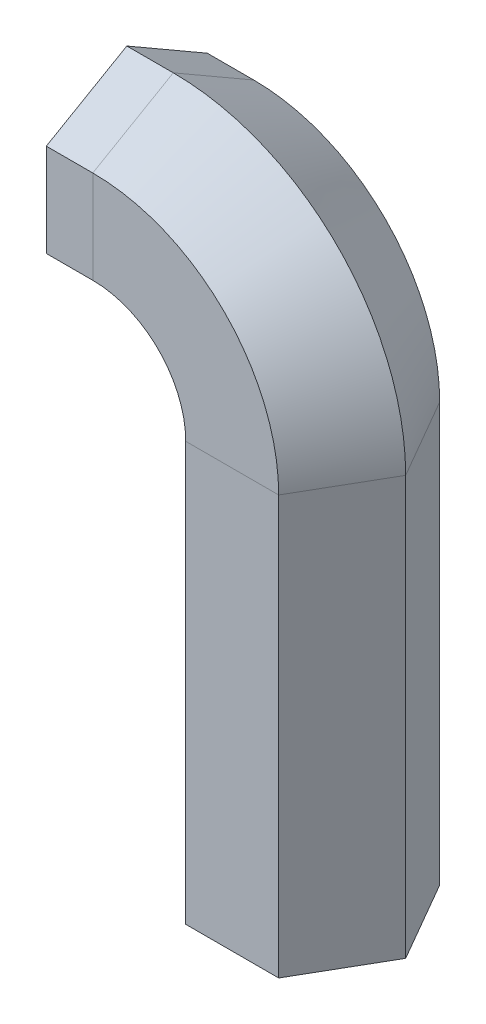
ISO-10303-21;
HEADER;
FILE_DESCRIPTION(('STEP AP214'),'2;1');
FILE_NAME('part.step','',(''),(''),'','','');
FILE_SCHEMA(('AUTOMOTIVE_DESIGN { 1 0 10303 214 1 1 1 1 }'));
ENDSEC;
DATA;
#1=APPLICATION_CONTEXT('core data for automotive mechanical design processes');
#2=APPLICATION_PROTOCOL_DEFINITION('international standard','automotive_design',2000,#1);
#3=PRODUCT_CONTEXT('',#1,'mechanical');
#4=PRODUCT('Part','Part','',(#3));
#5=PRODUCT_RELATED_PRODUCT_CATEGORY('part','',(#4));
#6=PRODUCT_DEFINITION_FORMATION('','',#4);
#7=PRODUCT_DEFINITION_CONTEXT('part definition',#1,'design');
#8=PRODUCT_DEFINITION('design','',#6,#7);
#9=PRODUCT_DEFINITION_SHAPE('','',#8);
#10=(LENGTH_UNIT() NAMED_UNIT(*) SI_UNIT(.MILLI.,.METRE.));
#11=(NAMED_UNIT(*) PLANE_ANGLE_UNIT() SI_UNIT($,.RADIAN.));
#12=(NAMED_UNIT(*) SI_UNIT($,.STERADIAN.) SOLID_ANGLE_UNIT());
#13=UNCERTAINTY_MEASURE_WITH_UNIT(LENGTH_MEASURE(1.E-05),#10,'distance_accuracy_value','');
#14=(GEOMETRIC_REPRESENTATION_CONTEXT(3) GLOBAL_UNCERTAINTY_ASSIGNED_CONTEXT((#13)) GLOBAL_UNIT_ASSIGNED_CONTEXT((#10,
#11,#12)) REPRESENTATION_CONTEXT('',''));
#15=CARTESIAN_POINT('',(0.,0.,0.));
#16=DIRECTION('',(0.,0.,1.));
#17=DIRECTION('',(1.,0.,0.));
#18=AXIS2_PLACEMENT_3D('',#15,#16,#17);
#19=CARTESIAN_POINT('',(0.,0.,0.));
#20=DIRECTION('',(0.,1.,0.));
#21=DIRECTION('',(0.,0.,1.));
#22=AXIS2_PLACEMENT_3D('',#19,#20,#21);
#23=PLANE('',#22);
#24=DIRECTION('',(1.,0.,0.));
#25=VECTOR('',#24,1.);
#26=CARTESIAN_POINT('',(-10.,0.,17.3205080756888));
#27=LINE('',#26,#25);
#28=CARTESIAN_POINT('',(-10.,0.,17.3205080756888));
#29=VERTEX_POINT('',#28);
#30=CARTESIAN_POINT('',(9.99999999999999,0.,17.3205080756888));
#31=VERTEX_POINT('',#30);
#32=EDGE_CURVE('E184',#29,#31,#27,.T.);
#33=ORIENTED_EDGE('',*,*,#32,.F.);
#34=DIRECTION('',(0.5,0.,0.866025403784439));
#35=VECTOR('',#34,1.);
#36=CARTESIAN_POINT('',(-20.,0.,0.));
#37=LINE('',#36,#35);
#38=CARTESIAN_POINT('',(-20.,0.,0.));
#39=VERTEX_POINT('',#38);
#40=EDGE_CURVE('E226',#39,#29,#37,.T.);
#41=ORIENTED_EDGE('',*,*,#40,.F.);
#42=DIRECTION('',(-0.5,0.,0.866025403784439));
#43=VECTOR('',#42,1.);
#44=CARTESIAN_POINT('',(-9.99999999999999,0.,-17.3205080756888));
#45=LINE('',#44,#43);
#46=CARTESIAN_POINT('',(-9.99999999999999,0.,-17.3205080756888));
#47=VERTEX_POINT('',#46);
#48=EDGE_CURVE('E213',#47,#39,#45,.T.);
#49=ORIENTED_EDGE('',*,*,#48,.F.);
#50=DIRECTION('',(-1.,0.,0.));
#51=VECTOR('',#50,1.);
#52=CARTESIAN_POINT('',(10.,0.,-17.3205080756888));
#53=LINE('',#52,#51);
#54=CARTESIAN_POINT('',(10.,0.,-17.3205080756888));
#55=VERTEX_POINT('',#54);
#56=EDGE_CURVE('E136',#55,#47,#53,.T.);
#57=ORIENTED_EDGE('',*,*,#56,.F.);
#58=DIRECTION('',(-0.5,0.,-0.866025403784439));
#59=VECTOR('',#58,1.);
#60=CARTESIAN_POINT('',(20.,0.,0.));
#61=LINE('',#60,#59);
#62=CARTESIAN_POINT('',(20.,0.,0.));
#63=VERTEX_POINT('',#62);
#64=EDGE_CURVE('E140',#63,#55,#61,.T.);
#65=ORIENTED_EDGE('',*,*,#64,.F.);
#66=DIRECTION('',(0.5,0.,-0.866025403784439));
#67=VECTOR('',#66,1.);
#68=CARTESIAN_POINT('',(9.99999999999999,0.,17.3205080756888));
#69=LINE('',#68,#67);
#70=EDGE_CURVE('E145',#31,#63,#69,.T.);
#71=ORIENTED_EDGE('',*,*,#70,.F.);
#72=EDGE_LOOP('',(#33,#41,#49,#57,#65,#71));
#73=FACE_BOUND('',#72,.T.);
#74=ADVANCED_FACE('F35',(#73),#23,.F.);
#75=CARTESIAN_POINT('',(-40.,120.,0.));
#76=DIRECTION('',(-1.,0.,0.));
#77=DIRECTION('',(0.,0.,1.));
#78=AXIS2_PLACEMENT_3D('',#75,#76,#77);
#79=PLANE('',#78);
#80=DIRECTION('',(0.,1.,0.));
#81=VECTOR('',#80,1.);
#82=CARTESIAN_POINT('',(-40.,110.,17.3205080756888));
#83=LINE('',#82,#81);
#84=CARTESIAN_POINT('',(-40.,110.,17.3205080756888));
#85=VERTEX_POINT('',#84);
#86=CARTESIAN_POINT('',(-40.,130.,17.3205080756888));
#87=VERTEX_POINT('',#86);
#88=EDGE_CURVE('E156',#85,#87,#83,.T.);
#89=ORIENTED_EDGE('',*,*,#88,.T.);
#90=DIRECTION('',(0.,0.5,-0.866025403784439));
#91=VECTOR('',#90,1.);
#92=CARTESIAN_POINT('',(-40.,130.,17.3205080756888));
#93=LINE('',#92,#91);
#94=CARTESIAN_POINT('',(-40.,140.,0.));
#95=VERTEX_POINT('',#94);
#96=EDGE_CURVE('E159',#87,#95,#93,.T.);
#97=ORIENTED_EDGE('',*,*,#96,.T.);
#98=DIRECTION('',(0.,-0.5,-0.866025403784439));
#99=VECTOR('',#98,1.);
#100=CARTESIAN_POINT('',(-40.,140.,0.));
#101=LINE('',#100,#99);
#102=CARTESIAN_POINT('',(-40.,130.,-17.3205080756888));
#103=VERTEX_POINT('',#102);
#104=EDGE_CURVE('E199',#95,#103,#101,.T.);
#105=ORIENTED_EDGE('',*,*,#104,.T.);
#106=DIRECTION('',(0.,-1.,0.));
#107=VECTOR('',#106,1.);
#108=CARTESIAN_POINT('',(-40.,130.,-17.3205080756888));
#109=LINE('',#108,#107);
#110=CARTESIAN_POINT('',(-40.,110.,-17.3205080756888));
#111=VERTEX_POINT('',#110);
#112=EDGE_CURVE('E54',#103,#111,#109,.T.);
#113=ORIENTED_EDGE('',*,*,#112,.T.);
#114=DIRECTION('',(0.,-0.5,0.866025403784439));
#115=VECTOR('',#114,1.);
#116=CARTESIAN_POINT('',(-40.,110.,-17.3205080756888));
#117=LINE('',#116,#115);
#118=CARTESIAN_POINT('',(-40.,100.,0.));
#119=VERTEX_POINT('',#118);
#120=EDGE_CURVE('E48',#111,#119,#117,.T.);
#121=ORIENTED_EDGE('',*,*,#120,.T.);
#122=DIRECTION('',(0.,0.5,0.866025403784439));
#123=VECTOR('',#122,1.);
#124=CARTESIAN_POINT('',(-40.,100.,0.));
#125=LINE('',#124,#123);
#126=EDGE_CURVE('E11',#119,#85,#125,.T.);
#127=ORIENTED_EDGE('',*,*,#126,.T.);
#128=EDGE_LOOP('',(#89,#97,#105,#113,#121,#127));
#129=FACE_BOUND('',#128,.T.);
#130=ADVANCED_FACE('F158',(#129),#79,.T.);
#131=CARTESIAN_POINT('',(-10.,0.,17.3205080756888));
#132=DIRECTION('',(0.,0.,1.));
#133=DIRECTION('',(1.,0.,0.));
#134=AXIS2_PLACEMENT_3D('',#131,#132,#133);
#135=PLANE('',#134);
#136=DIRECTION('',(0.,1.,0.));
#137=VECTOR('',#136,1.);
#138=CARTESIAN_POINT('',(9.99999999999999,0.,17.3205080756888));
#139=LINE('',#138,#137);
#140=CARTESIAN_POINT('',(9.99999999999999,89.9999999999999,17.3205080756888));
#141=VERTEX_POINT('',#140);
#142=EDGE_CURVE('E189',#31,#141,#139,.T.);
#143=ORIENTED_EDGE('',*,*,#142,.T.);
#144=DIRECTION('',(1.,0.,0.));
#145=VECTOR('',#144,1.);
#146=CARTESIAN_POINT('',(-10.,90.,17.3205080756888));
#147=LINE('',#146,#145);
#148=CARTESIAN_POINT('',(-10.,89.9999999999999,17.3205080756888));
#149=VERTEX_POINT('',#148);
#150=EDGE_CURVE('E258',#149,#141,#147,.T.);
#151=ORIENTED_EDGE('',*,*,#150,.F.);
#152=DIRECTION('',(0.,1.,0.));
#153=VECTOR('',#152,1.);
#154=CARTESIAN_POINT('',(-10.,0.,17.3205080756888));
#155=LINE('',#154,#153);
#156=EDGE_CURVE('E240',#29,#149,#155,.T.);
#157=ORIENTED_EDGE('',*,*,#156,.F.);
#158=ORIENTED_EDGE('',*,*,#32,.T.);
#159=EDGE_LOOP('',(#143,#151,#157,#158));
#160=FACE_BOUND('',#159,.T.);
#161=ADVANCED_FACE('F265',(#160),#135,.T.);
#162=CARTESIAN_POINT('',(9.99999999999999,0.,17.3205080756888));
#163=DIRECTION('',(0.866025403784438,0.,0.5));
#164=DIRECTION('',(0.5,0.,-0.866025403784439));
#165=AXIS2_PLACEMENT_3D('',#162,#163,#164);
#166=PLANE('',#165);
#167=DIRECTION('',(0.,1.,0.));
#168=VECTOR('',#167,1.);
#169=CARTESIAN_POINT('',(20.,0.,0.));
#170=LINE('',#169,#168);
#171=CARTESIAN_POINT('',(20.,89.9999999999999,0.));
#172=VERTEX_POINT('',#171);
#173=EDGE_CURVE('E188',#63,#172,#170,.T.);
#174=ORIENTED_EDGE('',*,*,#173,.T.);
#175=DIRECTION('',(0.5,0.,-0.866025403784439));
#176=VECTOR('',#175,1.);
#177=CARTESIAN_POINT('',(9.99999999999999,90.,17.3205080756888));
#178=LINE('',#177,#176);
#179=EDGE_CURVE('E185',#141,#172,#178,.T.);
#180=ORIENTED_EDGE('',*,*,#179,.F.);
#181=ORIENTED_EDGE('',*,*,#142,.F.);
#182=ORIENTED_EDGE('',*,*,#70,.T.);
#183=EDGE_LOOP('',(#174,#180,#181,#182));
#184=FACE_BOUND('',#183,.T.);
#185=ADVANCED_FACE('F268',(#184),#166,.T.);
#186=CARTESIAN_POINT('',(20.,0.,0.));
#187=DIRECTION('',(0.866025403784439,0.,-0.5));
#188=DIRECTION('',(-0.5,0.,-0.866025403784439));
#189=AXIS2_PLACEMENT_3D('',#186,#187,#188);
#190=PLANE('',#189);
#191=DIRECTION('',(0.,1.,0.));
#192=VECTOR('',#191,1.);
#193=CARTESIAN_POINT('',(10.,0.,-17.3205080756888));
#194=LINE('',#193,#192);
#195=CARTESIAN_POINT('',(10.,89.9999999999999,-17.3205080756888));
#196=VERTEX_POINT('',#195);
#197=EDGE_CURVE('E202',#55,#196,#194,.T.);
#198=ORIENTED_EDGE('',*,*,#197,.T.);
#199=DIRECTION('',(-0.5,0.,-0.866025403784439));
#200=VECTOR('',#199,1.);
#201=CARTESIAN_POINT('',(20.,90.,0.));
#202=LINE('',#201,#200);
#203=EDGE_CURVE('E192',#172,#196,#202,.T.);
#204=ORIENTED_EDGE('',*,*,#203,.F.);
#205=ORIENTED_EDGE('',*,*,#173,.F.);
#206=ORIENTED_EDGE('',*,*,#64,.T.);
#207=EDGE_LOOP('',(#198,#204,#205,#206));
#208=FACE_BOUND('',#207,.T.);
#209=ADVANCED_FACE('F322',(#208),#190,.T.);
#210=CARTESIAN_POINT('',(10.,0.,-17.3205080756888));
#211=DIRECTION('',(0.,0.,-1.));
#212=DIRECTION('',(-1.,0.,0.));
#213=AXIS2_PLACEMENT_3D('',#210,#211,#212);
#214=PLANE('',#213);
#215=DIRECTION('',(0.,1.,0.));
#216=VECTOR('',#215,1.);
#217=CARTESIAN_POINT('',(-9.99999999999999,0.,-17.3205080756888));
#218=LINE('',#217,#216);
#219=CARTESIAN_POINT('',(-9.99999999999999,89.9999999999999,-17.3205080756888));
#220=VERTEX_POINT('',#219);
#221=EDGE_CURVE('E215',#47,#220,#218,.T.);
#222=ORIENTED_EDGE('',*,*,#221,.T.);
#223=DIRECTION('',(-1.,0.,0.));
#224=VECTOR('',#223,1.);
#225=CARTESIAN_POINT('',(10.,90.,-17.3205080756888));
#226=LINE('',#225,#224);
#227=EDGE_CURVE('E205',#196,#220,#226,.T.);
#228=ORIENTED_EDGE('',*,*,#227,.F.);
#229=ORIENTED_EDGE('',*,*,#197,.F.);
#230=ORIENTED_EDGE('',*,*,#56,.T.);
#231=EDGE_LOOP('',(#222,#228,#229,#230));
#232=FACE_BOUND('',#231,.T.);
#233=ADVANCED_FACE('F330',(#232),#214,.T.);
#234=CARTESIAN_POINT('',(-9.99999999999999,0.,-17.3205080756888));
#235=DIRECTION('',(-0.866025403784438,0.,-0.5));
#236=DIRECTION('',(-0.5,0.,0.866025403784439));
#237=AXIS2_PLACEMENT_3D('',#234,#235,#236);
#238=PLANE('',#237);
#239=DIRECTION('',(0.,1.,0.));
#240=VECTOR('',#239,1.);
#241=CARTESIAN_POINT('',(-20.,0.,0.));
#242=LINE('',#241,#240);
#243=CARTESIAN_POINT('',(-20.,89.9999999999999,0.));
#244=VERTEX_POINT('',#243);
#245=EDGE_CURVE('E228',#39,#244,#242,.T.);
#246=ORIENTED_EDGE('',*,*,#245,.T.);
#247=DIRECTION('',(-0.5,0.,0.866025403784439));
#248=VECTOR('',#247,1.);
#249=CARTESIAN_POINT('',(-9.99999999999999,90.,-17.3205080756888));
#250=LINE('',#249,#248);
#251=EDGE_CURVE('E218',#220,#244,#250,.T.);
#252=ORIENTED_EDGE('',*,*,#251,.F.);
#253=ORIENTED_EDGE('',*,*,#221,.F.);
#254=ORIENTED_EDGE('',*,*,#48,.T.);
#255=EDGE_LOOP('',(#246,#252,#253,#254));
#256=FACE_BOUND('',#255,.T.);
#257=ADVANCED_FACE('F340',(#256),#238,.T.);
#258=CARTESIAN_POINT('',(-20.,0.,0.));
#259=DIRECTION('',(-0.866025403784439,0.,0.5));
#260=DIRECTION('',(0.5,0.,0.866025403784439));
#261=AXIS2_PLACEMENT_3D('',#258,#259,#260);
#262=PLANE('',#261);
#263=DIRECTION('',(0.5,0.,0.866025403784439));
#264=VECTOR('',#263,1.);
#265=CARTESIAN_POINT('',(-20.,90.,0.));
#266=LINE('',#265,#264);
#267=EDGE_CURVE('E231',#244,#149,#266,.T.);
#268=ORIENTED_EDGE('',*,*,#267,.F.);
#269=ORIENTED_EDGE('',*,*,#245,.F.);
#270=ORIENTED_EDGE('',*,*,#40,.T.);
#271=ORIENTED_EDGE('',*,*,#156,.T.);
#272=EDGE_LOOP('',(#268,#269,#270,#271));
#273=FACE_BOUND('',#272,.T.);
#274=ADVANCED_FACE('F281',(#273),#262,.T.);
#275=CARTESIAN_POINT('',(-10.,90.,17.3205080756888));
#276=DIRECTION('',(0.,0.,1.));
#277=DIRECTION('',(1.,0.,0.));
#278=AXIS2_PLACEMENT_3D('',#275,#276,#277);
#279=PLANE('',#278);
#280=CARTESIAN_POINT('',(-30.,90.,17.3205080756888));
#281=DIRECTION('',(0.,0.,1.));
#282=DIRECTION('',(1.,0.,0.));
#283=AXIS2_PLACEMENT_3D('',#280,#281,#282);
#284=CIRCLE('',#283,40.);
#285=CARTESIAN_POINT('',(-30.,130.,17.3205080756888));
#286=VERTEX_POINT('',#285);
#287=EDGE_CURVE('E195',#141,#286,#284,.T.);
#288=ORIENTED_EDGE('',*,*,#287,.T.);
#289=DIRECTION('',(0.,1.,0.));
#290=VECTOR('',#289,1.);
#291=CARTESIAN_POINT('',(-30.,110.,17.3205080756888));
#292=LINE('',#291,#290);
#293=CARTESIAN_POINT('',(-30.,110.,17.3205080756888));
#294=VERTEX_POINT('',#293);
#295=EDGE_CURVE('E177',#294,#286,#292,.T.);
#296=ORIENTED_EDGE('',*,*,#295,.F.);
#297=CARTESIAN_POINT('',(-30.,90.,17.3205080756888));
#298=DIRECTION('',(0.,0.,1.));
#299=DIRECTION('',(1.,0.,0.));
#300=AXIS2_PLACEMENT_3D('',#297,#298,#299);
#301=CIRCLE('',#300,20.);
#302=EDGE_CURVE('E242',#149,#294,#301,.T.);
#303=ORIENTED_EDGE('',*,*,#302,.F.);
#304=ORIENTED_EDGE('',*,*,#150,.T.);
#305=EDGE_LOOP('',(#288,#296,#303,#304));
#306=FACE_BOUND('',#305,.T.);
#307=ADVANCED_FACE('F248',(#306),#279,.T.);
#308=CARTESIAN_POINT('',(-30.,90.,17.3205080756888));
#309=DIRECTION('',(0.,0.,-1.));
#310=DIRECTION('',(-1.,0.,0.));
#311=AXIS2_PLACEMENT_3D('',#308,#309,#310);
#312=CONICAL_SURFACE('',#311,40.,0.523598775598299);
#313=CARTESIAN_POINT('',(-30.,90.,0.));
#314=DIRECTION('',(0.,0.,1.));
#315=DIRECTION('',(1.,0.,0.));
#316=AXIS2_PLACEMENT_3D('',#313,#314,#315);
#317=CIRCLE('',#316,50.);
#318=CARTESIAN_POINT('',(-30.,140.,0.));
#319=VERTEX_POINT('',#318);
#320=EDGE_CURVE('E123',#172,#319,#317,.T.);
#321=ORIENTED_EDGE('',*,*,#320,.T.);
#322=DIRECTION('',(0.,0.5,-0.866025403784439));
#323=VECTOR('',#322,1.);
#324=CARTESIAN_POINT('',(-30.,130.,17.3205080756888));
#325=LINE('',#324,#323);
#326=EDGE_CURVE('E193',#286,#319,#325,.T.);
#327=ORIENTED_EDGE('',*,*,#326,.F.);
#328=ORIENTED_EDGE('',*,*,#287,.F.);
#329=ORIENTED_EDGE('',*,*,#179,.T.);
#330=EDGE_LOOP('',(#321,#327,#328,#329));
#331=FACE_BOUND('',#330,.T.);
#332=ADVANCED_FACE('F271',(#331),#312,.T.);
#333=CARTESIAN_POINT('',(-30.,90.,0.));
#334=DIRECTION('',(0.,0.,1.));
#335=DIRECTION('',(1.,0.,0.));
#336=AXIS2_PLACEMENT_3D('',#333,#334,#335);
#337=CONICAL_SURFACE('',#336,50.,0.523598775598299);
#338=CARTESIAN_POINT('',(-30.,90.,-17.3205080756888));
#339=DIRECTION('',(0.,0.,1.));
#340=DIRECTION('',(1.,0.,0.));
#341=AXIS2_PLACEMENT_3D('',#338,#339,#340);
#342=CIRCLE('',#341,40.);
#343=CARTESIAN_POINT('',(-30.,130.,-17.3205080756888));
#344=VERTEX_POINT('',#343);
#345=EDGE_CURVE('E114',#196,#344,#342,.T.);
#346=ORIENTED_EDGE('',*,*,#345,.T.);
#347=DIRECTION('',(0.,-0.5,-0.866025403784439));
#348=VECTOR('',#347,1.);
#349=CARTESIAN_POINT('',(-30.,140.,0.));
#350=LINE('',#349,#348);
#351=EDGE_CURVE('E196',#319,#344,#350,.T.);
#352=ORIENTED_EDGE('',*,*,#351,.F.);
#353=ORIENTED_EDGE('',*,*,#320,.F.);
#354=ORIENTED_EDGE('',*,*,#203,.T.);
#355=EDGE_LOOP('',(#346,#352,#353,#354));
#356=FACE_BOUND('',#355,.T.);
#357=ADVANCED_FACE('F273',(#356),#337,.T.);
#358=CARTESIAN_POINT('',(10.,90.,-17.3205080756888));
#359=DIRECTION('',(0.,0.,-1.));
#360=DIRECTION('',(-1.,0.,0.));
#361=AXIS2_PLACEMENT_3D('',#358,#359,#360);
#362=PLANE('',#361);
#363=CARTESIAN_POINT('',(-30.,90.,-17.3205080756888));
#364=DIRECTION('',(0.,0.,1.));
#365=DIRECTION('',(1.,0.,0.));
#366=AXIS2_PLACEMENT_3D('',#363,#364,#365);
#367=CIRCLE('',#366,20.);
#368=CARTESIAN_POINT('',(-30.,110.,-17.3205080756888));
#369=VERTEX_POINT('',#368);
#370=EDGE_CURVE('E107',#220,#369,#367,.T.);
#371=ORIENTED_EDGE('',*,*,#370,.T.);
#372=DIRECTION('',(0.,-1.,0.));
#373=VECTOR('',#372,1.);
#374=CARTESIAN_POINT('',(-30.,130.,-17.3205080756888));
#375=LINE('',#374,#373);
#376=EDGE_CURVE('E209',#344,#369,#375,.T.);
#377=ORIENTED_EDGE('',*,*,#376,.F.);
#378=ORIENTED_EDGE('',*,*,#345,.F.);
#379=ORIENTED_EDGE('',*,*,#227,.T.);
#380=EDGE_LOOP('',(#371,#377,#378,#379));
#381=FACE_BOUND('',#380,.T.);
#382=ADVANCED_FACE('F279',(#381),#362,.T.);
#383=CARTESIAN_POINT('',(-30.,90.,-17.3205080756888));
#384=DIRECTION('',(0.,0.,-1.));
#385=DIRECTION('',(-1.,0.,0.));
#386=AXIS2_PLACEMENT_3D('',#383,#384,#385);
#387=CONICAL_SURFACE('',#386,20.,0.523598775598299);
#388=CARTESIAN_POINT('',(-30.,90.,0.));
#389=DIRECTION('',(0.,0.,1.));
#390=DIRECTION('',(1.,0.,0.));
#391=AXIS2_PLACEMENT_3D('',#388,#389,#390);
#392=CIRCLE('',#391,10.);
#393=CARTESIAN_POINT('',(-30.,100.,0.));
#394=VERTEX_POINT('',#393);
#395=EDGE_CURVE('E233',#244,#394,#392,.T.);
#396=ORIENTED_EDGE('',*,*,#395,.T.);
#397=DIRECTION('',(0.,-0.5,0.866025403784439));
#398=VECTOR('',#397,1.);
#399=CARTESIAN_POINT('',(-30.,110.,-17.3205080756888));
#400=LINE('',#399,#398);
#401=EDGE_CURVE('E221',#369,#394,#400,.T.);
#402=ORIENTED_EDGE('',*,*,#401,.F.);
#403=ORIENTED_EDGE('',*,*,#370,.F.);
#404=ORIENTED_EDGE('',*,*,#251,.T.);
#405=EDGE_LOOP('',(#396,#402,#403,#404));
#406=FACE_BOUND('',#405,.T.);
#407=ADVANCED_FACE('F383',(#406),#387,.F.);
#408=CARTESIAN_POINT('',(-30.,90.,0.));
#409=DIRECTION('',(0.,0.,1.));
#410=DIRECTION('',(1.,0.,0.));
#411=AXIS2_PLACEMENT_3D('',#408,#409,#410);
#412=CONICAL_SURFACE('',#411,10.,0.523598775598298);
#413=DIRECTION('',(0.,0.5,0.866025403784439));
#414=VECTOR('',#413,1.);
#415=CARTESIAN_POINT('',(-30.,100.,0.));
#416=LINE('',#415,#414);
#417=EDGE_CURVE('E182',#394,#294,#416,.T.);
#418=ORIENTED_EDGE('',*,*,#417,.F.);
#419=ORIENTED_EDGE('',*,*,#395,.F.);
#420=ORIENTED_EDGE('',*,*,#267,.T.);
#421=ORIENTED_EDGE('',*,*,#302,.T.);
#422=EDGE_LOOP('',(#418,#419,#420,#421));
#423=FACE_BOUND('',#422,.T.);
#424=ADVANCED_FACE('F251',(#423),#412,.F.);
#425=CARTESIAN_POINT('',(-30.,110.,17.3205080756888));
#426=DIRECTION('',(0.,0.,1.));
#427=DIRECTION('',(0.,-1.,0.));
#428=AXIS2_PLACEMENT_3D('',#425,#426,#427);
#429=PLANE('',#428);
#430=DIRECTION('',(-1.,0.,0.));
#431=VECTOR('',#430,1.);
#432=CARTESIAN_POINT('',(-30.,130.,17.3205080756888));
#433=LINE('',#432,#431);
#434=EDGE_CURVE('E164',#286,#87,#433,.T.);
#435=ORIENTED_EDGE('',*,*,#434,.T.);
#436=ORIENTED_EDGE('',*,*,#88,.F.);
#437=DIRECTION('',(-1.,0.,0.));
#438=VECTOR('',#437,1.);
#439=CARTESIAN_POINT('',(-30.,110.,17.3205080756888));
#440=LINE('',#439,#438);
#441=EDGE_CURVE('E165',#294,#85,#440,.T.);
#442=ORIENTED_EDGE('',*,*,#441,.F.);
#443=ORIENTED_EDGE('',*,*,#295,.T.);
#444=EDGE_LOOP('',(#435,#436,#442,#443));
#445=FACE_BOUND('',#444,.T.);
#446=ADVANCED_FACE('F175',(#445),#429,.T.);
#447=CARTESIAN_POINT('',(-30.,130.,17.3205080756888));
#448=DIRECTION('',(0.,0.866025403784438,0.5));
#449=DIRECTION('',(0.,-0.5,0.866025403784439));
#450=AXIS2_PLACEMENT_3D('',#447,#448,#449);
#451=PLANE('',#450);
#452=DIRECTION('',(-1.,0.,0.));
#453=VECTOR('',#452,1.);
#454=CARTESIAN_POINT('',(-30.,140.,0.));
#455=LINE('',#454,#453);
#456=EDGE_CURVE('E172',#319,#95,#455,.T.);
#457=ORIENTED_EDGE('',*,*,#456,.T.);
#458=ORIENTED_EDGE('',*,*,#96,.F.);
#459=ORIENTED_EDGE('',*,*,#434,.F.);
#460=ORIENTED_EDGE('',*,*,#326,.T.);
#461=EDGE_LOOP('',(#457,#458,#459,#460));
#462=FACE_BOUND('',#461,.T.);
#463=ADVANCED_FACE('F169',(#462),#451,.T.);
#464=CARTESIAN_POINT('',(-30.,140.,0.));
#465=DIRECTION('',(0.,0.866025403784439,-0.5));
#466=DIRECTION('',(0.,0.5,0.866025403784439));
#467=AXIS2_PLACEMENT_3D('',#464,#465,#466);
#468=PLANE('',#467);
#469=DIRECTION('',(-1.,0.,0.));
#470=VECTOR('',#469,1.);
#471=CARTESIAN_POINT('',(-30.,130.,-17.3205080756888));
#472=LINE('',#471,#470);
#473=EDGE_CURVE('E92',#344,#103,#472,.T.);
#474=ORIENTED_EDGE('',*,*,#473,.T.);
#475=ORIENTED_EDGE('',*,*,#104,.F.);
#476=ORIENTED_EDGE('',*,*,#456,.F.);
#477=ORIENTED_EDGE('',*,*,#351,.T.);
#478=EDGE_LOOP('',(#474,#475,#476,#477));
#479=FACE_BOUND('',#478,.T.);
#480=ADVANCED_FACE('F415',(#479),#468,.T.);
#481=CARTESIAN_POINT('',(-30.,130.,-17.3205080756888));
#482=DIRECTION('',(0.,0.,-1.));
#483=DIRECTION('',(0.,1.,0.));
#484=AXIS2_PLACEMENT_3D('',#481,#482,#483);
#485=PLANE('',#484);
#486=DIRECTION('',(-1.,0.,0.));
#487=VECTOR('',#486,1.);
#488=CARTESIAN_POINT('',(-30.,110.,-17.3205080756888));
#489=LINE('',#488,#487);
#490=EDGE_CURVE('E84',#369,#111,#489,.T.);
#491=ORIENTED_EDGE('',*,*,#490,.T.);
#492=ORIENTED_EDGE('',*,*,#112,.F.);
#493=ORIENTED_EDGE('',*,*,#473,.F.);
#494=ORIENTED_EDGE('',*,*,#376,.T.);
#495=EDGE_LOOP('',(#491,#492,#493,#494));
#496=FACE_BOUND('',#495,.T.);
#497=ADVANCED_FACE('F291',(#496),#485,.T.);
#498=CARTESIAN_POINT('',(-30.,110.,-17.3205080756888));
#499=DIRECTION('',(0.,-0.866025403784438,-0.5));
#500=DIRECTION('',(0.,0.5,-0.866025403784439));
#501=AXIS2_PLACEMENT_3D('',#498,#499,#500);
#502=PLANE('',#501);
#503=DIRECTION('',(-1.,0.,0.));
#504=VECTOR('',#503,1.);
#505=CARTESIAN_POINT('',(-30.,100.,0.));
#506=LINE('',#505,#504);
#507=EDGE_CURVE('E42',#394,#119,#506,.T.);
#508=ORIENTED_EDGE('',*,*,#507,.T.);
#509=ORIENTED_EDGE('',*,*,#120,.F.);
#510=ORIENTED_EDGE('',*,*,#490,.F.);
#511=ORIENTED_EDGE('',*,*,#401,.T.);
#512=EDGE_LOOP('',(#508,#509,#510,#511));
#513=FACE_BOUND('',#512,.T.);
#514=ADVANCED_FACE('F286',(#513),#502,.T.);
#515=CARTESIAN_POINT('',(-30.,100.,0.));
#516=DIRECTION('',(0.,-0.866025403784439,0.5));
#517=DIRECTION('',(0.,-0.5,-0.866025403784439));
#518=AXIS2_PLACEMENT_3D('',#515,#516,#517);
#519=PLANE('',#518);
#520=ORIENTED_EDGE('',*,*,#126,.F.);
#521=ORIENTED_EDGE('',*,*,#507,.F.);
#522=ORIENTED_EDGE('',*,*,#417,.T.);
#523=ORIENTED_EDGE('',*,*,#441,.T.);
#524=EDGE_LOOP('',(#520,#521,#522,#523));
#525=FACE_BOUND('',#524,.T.);
#526=ADVANCED_FACE('F243',(#525),#519,.T.);
#527=CLOSED_SHELL('',(#74,#130,#161,#185,#209,#233,#257,#274,#307,#332,#357,#382,#407,#424,#446,
#463,#480,#497,#514,#526));
#528=MANIFOLD_SOLID_BREP('B2',#527);
#529=ADVANCED_BREP_SHAPE_REPRESENTATION('',(#18,#528),#14);
#530=SHAPE_DEFINITION_REPRESENTATION(#9,#529);
ENDSEC;
END-ISO-10303-21;
